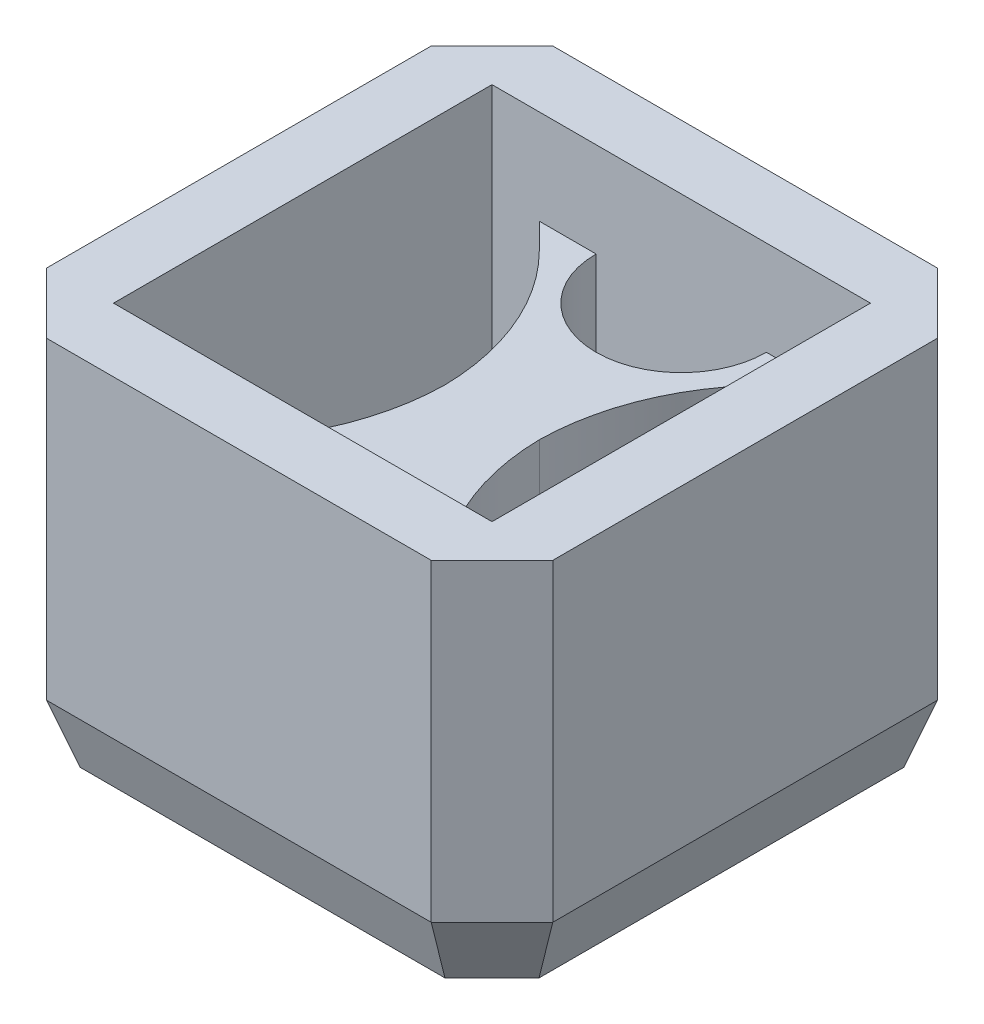
ISO-10303-21;
HEADER;
FILE_DESCRIPTION(('STEP AP214'),'2;1');
FILE_NAME('part.step','',(''),(''),'','','');
FILE_SCHEMA(('AUTOMOTIVE_DESIGN { 1 0 10303 214 1 1 1 1 }'));
ENDSEC;
DATA;
#1=APPLICATION_CONTEXT('core data for automotive mechanical design processes');
#2=APPLICATION_PROTOCOL_DEFINITION('international standard','automotive_design',2000,#1);
#3=PRODUCT_CONTEXT('',#1,'mechanical');
#4=PRODUCT('Part','Part','',(#3));
#5=PRODUCT_RELATED_PRODUCT_CATEGORY('part','',(#4));
#6=PRODUCT_DEFINITION_FORMATION('','',#4);
#7=PRODUCT_DEFINITION_CONTEXT('part definition',#1,'design');
#8=PRODUCT_DEFINITION('design','',#6,#7);
#9=PRODUCT_DEFINITION_SHAPE('','',#8);
#10=(LENGTH_UNIT() NAMED_UNIT(*) SI_UNIT(.MILLI.,.METRE.));
#11=(NAMED_UNIT(*) PLANE_ANGLE_UNIT() SI_UNIT($,.RADIAN.));
#12=(NAMED_UNIT(*) SI_UNIT($,.STERADIAN.) SOLID_ANGLE_UNIT());
#13=UNCERTAINTY_MEASURE_WITH_UNIT(LENGTH_MEASURE(1.E-05),#10,'distance_accuracy_value','');
#14=(GEOMETRIC_REPRESENTATION_CONTEXT(3) GLOBAL_UNCERTAINTY_ASSIGNED_CONTEXT((#13)) GLOBAL_UNIT_ASSIGNED_CONTEXT((#10,
#11,#12)) REPRESENTATION_CONTEXT('',''));
#15=CARTESIAN_POINT('',(0.,0.,0.));
#16=DIRECTION('',(0.,0.,1.));
#17=DIRECTION('',(1.,0.,0.));
#18=AXIS2_PLACEMENT_3D('',#15,#16,#17);
#19=CARTESIAN_POINT('',(4.,8.,4.));
#20=DIRECTION('',(0.,0.,-1.));
#21=DIRECTION('',(-1.,0.,0.));
#22=AXIS2_PLACEMENT_3D('',#19,#20,#21);
#23=PLANE('',#22);
#24=DIRECTION('',(-1.,0.,0.));
#25=VECTOR('',#24,1.);
#26=CARTESIAN_POINT('',(3.,6.,4.));
#27=LINE('',#26,#25);
#28=CARTESIAN_POINT('',(3.,6.,4.));
#29=VERTEX_POINT('',#28);
#30=CARTESIAN_POINT('',(1.8,6.,4.));
#31=VERTEX_POINT('',#30);
#32=EDGE_CURVE('E338',#29,#31,#27,.T.);
#33=ORIENTED_EDGE('',*,*,#32,.T.);
#34=DIRECTION('',(0.,-1.,0.));
#35=VECTOR('',#34,1.);
#36=CARTESIAN_POINT('',(1.8,18.,4.));
#37=LINE('',#36,#35);
#38=CARTESIAN_POINT('',(1.8,0.,4.));
#39=VERTEX_POINT('',#38);
#40=EDGE_CURVE('E337',#31,#39,#37,.T.);
#41=ORIENTED_EDGE('',*,*,#40,.T.);
#42=DIRECTION('',(1.,0.,0.));
#43=VECTOR('',#42,1.);
#44=CARTESIAN_POINT('',(4.,0.,4.));
#45=LINE('',#44,#43);
#46=CARTESIAN_POINT('',(-1.8,0.,4.));
#47=VERTEX_POINT('',#46);
#48=EDGE_CURVE('E363',#47,#39,#45,.T.);
#49=ORIENTED_EDGE('',*,*,#48,.F.);
#50=DIRECTION('',(0.,-1.,0.));
#51=VECTOR('',#50,1.);
#52=CARTESIAN_POINT('',(-1.8,18.,4.));
#53=LINE('',#52,#51);
#54=CARTESIAN_POINT('',(-1.8,6.,4.));
#55=VERTEX_POINT('',#54);
#56=EDGE_CURVE('E334',#55,#47,#53,.T.);
#57=ORIENTED_EDGE('',*,*,#56,.F.);
#58=DIRECTION('',(-1.,0.,0.));
#59=VECTOR('',#58,1.);
#60=CARTESIAN_POINT('',(-3.,6.,4.));
#61=LINE('',#60,#59);
#62=CARTESIAN_POINT('',(-3.,6.,4.));
#63=VERTEX_POINT('',#62);
#64=EDGE_CURVE('E332',#55,#63,#61,.T.);
#65=ORIENTED_EDGE('',*,*,#64,.T.);
#66=DIRECTION('',(0.,-1.,0.));
#67=VECTOR('',#66,1.);
#68=CARTESIAN_POINT('',(-3.,18.,4.));
#69=LINE('',#68,#67);
#70=CARTESIAN_POINT('',(-3.,0.,4.));
#71=VERTEX_POINT('',#70);
#72=EDGE_CURVE('E331',#63,#71,#69,.T.);
#73=ORIENTED_EDGE('',*,*,#72,.T.);
#74=CARTESIAN_POINT('',(-4.,0.,4.));
#75=VERTEX_POINT('',#74);
#76=EDGE_CURVE('E359',#75,#71,#45,.T.);
#77=ORIENTED_EDGE('',*,*,#76,.F.);
#78=DIRECTION('',(0.,-1.,0.));
#79=VECTOR('',#78,1.);
#80=CARTESIAN_POINT('',(-4.,8.,4.));
#81=LINE('',#80,#79);
#82=CARTESIAN_POINT('',(-4.,8.,4.));
#83=VERTEX_POINT('',#82);
#84=EDGE_CURVE('E376',#83,#75,#81,.T.);
#85=ORIENTED_EDGE('',*,*,#84,.F.);
#86=DIRECTION('',(1.,0.,0.));
#87=VECTOR('',#86,1.);
#88=CARTESIAN_POINT('',(4.,8.,4.));
#89=LINE('',#88,#87);
#90=CARTESIAN_POINT('',(4.,8.,4.));
#91=VERTEX_POINT('',#90);
#92=EDGE_CURVE('E349',#83,#91,#89,.T.);
#93=ORIENTED_EDGE('',*,*,#92,.T.);
#94=DIRECTION('',(0.,-1.,0.));
#95=VECTOR('',#94,1.);
#96=CARTESIAN_POINT('',(4.,8.,4.));
#97=LINE('',#96,#95);
#98=CARTESIAN_POINT('',(4.,0.,4.));
#99=VERTEX_POINT('',#98);
#100=EDGE_CURVE('E373',#91,#99,#97,.T.);
#101=ORIENTED_EDGE('',*,*,#100,.T.);
#102=CARTESIAN_POINT('',(3.,0.,4.));
#103=VERTEX_POINT('',#102);
#104=EDGE_CURVE('E358',#103,#99,#45,.T.);
#105=ORIENTED_EDGE('',*,*,#104,.F.);
#106=DIRECTION('',(0.,-1.,0.));
#107=VECTOR('',#106,1.);
#108=CARTESIAN_POINT('',(3.,18.,4.));
#109=LINE('',#108,#107);
#110=EDGE_CURVE('E326',#29,#103,#109,.T.);
#111=ORIENTED_EDGE('',*,*,#110,.F.);
#112=EDGE_LOOP('',(#33,#41,#49,#57,#65,#73,#77,#85,#93,#101,#105,#111));
#113=FACE_BOUND('',#112,.T.);
#114=ADVANCED_FACE('F37',(#113),#23,.T.);
#115=CARTESIAN_POINT('',(4.,8.,-4.));
#116=DIRECTION('',(0.,0.,1.));
#117=DIRECTION('',(1.,0.,0.));
#118=AXIS2_PLACEMENT_3D('',#115,#116,#117);
#119=PLANE('',#118);
#120=DIRECTION('',(-1.,0.,0.));
#121=VECTOR('',#120,1.);
#122=CARTESIAN_POINT('',(3.,6.,-4.));
#123=LINE('',#122,#121);
#124=CARTESIAN_POINT('',(3.,6.,-4.));
#125=VERTEX_POINT('',#124);
#126=CARTESIAN_POINT('',(1.8,6.,-4.));
#127=VERTEX_POINT('',#126);
#128=EDGE_CURVE('E249',#125,#127,#123,.T.);
#129=ORIENTED_EDGE('',*,*,#128,.F.);
#130=DIRECTION('',(0.,-1.,0.));
#131=VECTOR('',#130,1.);
#132=CARTESIAN_POINT('',(3.,18.,-4.));
#133=LINE('',#132,#131);
#134=CARTESIAN_POINT('',(3.,0.,-4.));
#135=VERTEX_POINT('',#134);
#136=EDGE_CURVE('E257',#125,#135,#133,.T.);
#137=ORIENTED_EDGE('',*,*,#136,.T.);
#138=DIRECTION('',(-1.,0.,0.));
#139=VECTOR('',#138,1.);
#140=CARTESIAN_POINT('',(4.,0.,-4.));
#141=LINE('',#140,#139);
#142=CARTESIAN_POINT('',(4.,0.,-4.));
#143=VERTEX_POINT('',#142);
#144=EDGE_CURVE('E350',#143,#135,#141,.T.);
#145=ORIENTED_EDGE('',*,*,#144,.F.);
#146=DIRECTION('',(0.,-1.,0.));
#147=VECTOR('',#146,1.);
#148=CARTESIAN_POINT('',(4.,8.,-4.));
#149=LINE('',#148,#147);
#150=CARTESIAN_POINT('',(4.,8.,-4.));
#151=VERTEX_POINT('',#150);
#152=EDGE_CURVE('E370',#151,#143,#149,.T.);
#153=ORIENTED_EDGE('',*,*,#152,.F.);
#154=DIRECTION('',(-1.,0.,0.));
#155=VECTOR('',#154,1.);
#156=CARTESIAN_POINT('',(4.,8.,-4.));
#157=LINE('',#156,#155);
#158=CARTESIAN_POINT('',(-4.,8.,-4.));
#159=VERTEX_POINT('',#158);
#160=EDGE_CURVE('E354',#151,#159,#157,.T.);
#161=ORIENTED_EDGE('',*,*,#160,.T.);
#162=DIRECTION('',(0.,-1.,0.));
#163=VECTOR('',#162,1.);
#164=CARTESIAN_POINT('',(-4.,8.,-4.));
#165=LINE('',#164,#163);
#166=CARTESIAN_POINT('',(-4.,0.,-4.));
#167=VERTEX_POINT('',#166);
#168=EDGE_CURVE('E356',#159,#167,#165,.T.);
#169=ORIENTED_EDGE('',*,*,#168,.T.);
#170=CARTESIAN_POINT('',(-3.,0.,-4.));
#171=VERTEX_POINT('',#170);
#172=EDGE_CURVE('E365',#171,#167,#141,.T.);
#173=ORIENTED_EDGE('',*,*,#172,.F.);
#174=DIRECTION('',(0.,-1.,0.));
#175=VECTOR('',#174,1.);
#176=CARTESIAN_POINT('',(-3.,18.,-4.));
#177=LINE('',#176,#175);
#178=CARTESIAN_POINT('',(-3.,6.,-4.));
#179=VERTEX_POINT('',#178);
#180=EDGE_CURVE('E278',#179,#171,#177,.T.);
#181=ORIENTED_EDGE('',*,*,#180,.F.);
#182=DIRECTION('',(-1.,0.,0.));
#183=VECTOR('',#182,1.);
#184=CARTESIAN_POINT('',(-3.,6.,-4.));
#185=LINE('',#184,#183);
#186=CARTESIAN_POINT('',(-1.8,6.,-4.));
#187=VERTEX_POINT('',#186);
#188=EDGE_CURVE('E265',#187,#179,#185,.T.);
#189=ORIENTED_EDGE('',*,*,#188,.F.);
#190=DIRECTION('',(0.,-1.,0.));
#191=VECTOR('',#190,1.);
#192=CARTESIAN_POINT('',(-1.8,18.,-4.));
#193=LINE('',#192,#191);
#194=CARTESIAN_POINT('',(-1.8,0.,-4.));
#195=VERTEX_POINT('',#194);
#196=EDGE_CURVE('E263',#187,#195,#193,.T.);
#197=ORIENTED_EDGE('',*,*,#196,.T.);
#198=CARTESIAN_POINT('',(1.8,0.,-4.));
#199=VERTEX_POINT('',#198);
#200=EDGE_CURVE('E252',#199,#195,#141,.T.);
#201=ORIENTED_EDGE('',*,*,#200,.F.);
#202=DIRECTION('',(0.,-1.,0.));
#203=VECTOR('',#202,1.);
#204=CARTESIAN_POINT('',(1.8,18.,-4.));
#205=LINE('',#204,#203);
#206=EDGE_CURVE('E244',#127,#199,#205,.T.);
#207=ORIENTED_EDGE('',*,*,#206,.F.);
#208=EDGE_LOOP('',(#129,#137,#145,#153,#161,#169,#173,#181,#189,#197,#201,#207));
#209=FACE_BOUND('',#208,.T.);
#210=ADVANCED_FACE('F246',(#209),#119,.T.);
#211=CARTESIAN_POINT('',(0.,18.,4.));
#212=DIRECTION('',(0.,-1.,0.));
#213=DIRECTION('',(0.,0.,-1.));
#214=AXIS2_PLACEMENT_3D('',#211,#212,#213);
#215=CYLINDRICAL_SURFACE('',#214,1.8);
#216=ORIENTED_EDGE('',*,*,#56,.T.);
#217=CARTESIAN_POINT('',(0.,0.,4.));
#218=DIRECTION('',(0.,1.,0.));
#219=DIRECTION('',(0.,0.,-1.));
#220=AXIS2_PLACEMENT_3D('',#217,#218,#219);
#221=CIRCLE('',#220,1.8);
#222=EDGE_CURVE('E322',#39,#47,#221,.T.);
#223=ORIENTED_EDGE('',*,*,#222,.F.);
#224=ORIENTED_EDGE('',*,*,#40,.F.);
#225=CARTESIAN_POINT('',(0.,6.,4.));
#226=DIRECTION('',(0.,1.,0.));
#227=DIRECTION('',(0.,0.,1.));
#228=AXIS2_PLACEMENT_3D('',#225,#226,#227);
#229=CIRCLE('',#228,1.8);
#230=EDGE_CURVE('E335',#31,#55,#229,.T.);
#231=ORIENTED_EDGE('',*,*,#230,.T.);
#232=EDGE_LOOP('',(#216,#223,#224,#231));
#233=FACE_BOUND('',#232,.T.);
#234=ADVANCED_FACE('F606',(#233),#215,.F.);
#235=CARTESIAN_POINT('',(4.,0.,0.));
#236=DIRECTION('',(0.,0.,1.));
#237=DIRECTION('',(1.,0.,0.));
#238=AXIS2_PLACEMENT_3D('',#235,#236,#237);
#239=PLANE('',#238);
#240=DIRECTION('',(0.,-1.,0.));
#241=VECTOR('',#240,1.);
#242=CARTESIAN_POINT('',(1.,0.,0.));
#243=LINE('',#242,#241);
#244=CARTESIAN_POINT('',(1.,6.,0.));
#245=VERTEX_POINT('',#244);
#246=CARTESIAN_POINT('',(1.,0.,0.));
#247=VERTEX_POINT('',#246);
#248=EDGE_CURVE('E475',#245,#247,#243,.T.);
#249=ORIENTED_EDGE('',*,*,#248,.F.);
#250=DIRECTION('',(1.,0.,0.));
#251=VECTOR('',#250,1.);
#252=CARTESIAN_POINT('',(0.,6.,0.));
#253=LINE('',#252,#251);
#254=CARTESIAN_POINT('',(1.00050508889981,6.,0.));
#255=VERTEX_POINT('',#254);
#256=EDGE_CURVE('E284',#245,#255,#253,.T.);
#257=ORIENTED_EDGE('',*,*,#256,.T.);
#258=DIRECTION('',(0.,1.,0.));
#259=VECTOR('',#258,1.);
#260=CARTESIAN_POINT('',(1.00050508889981,18.,0.));
#261=LINE('',#260,#259);
#262=CARTESIAN_POINT('',(1.00050508889981,0.,0.));
#263=VERTEX_POINT('',#262);
#264=EDGE_CURVE('E469',#263,#255,#261,.T.);
#265=ORIENTED_EDGE('',*,*,#264,.F.);
#266=DIRECTION('',(1.,0.,0.));
#267=VECTOR('',#266,1.);
#268=CARTESIAN_POINT('',(4.,0.,0.));
#269=LINE('',#268,#267);
#270=EDGE_CURVE('E285',#247,#263,#269,.T.);
#271=ORIENTED_EDGE('',*,*,#270,.F.);
#272=EDGE_LOOP('',(#249,#257,#265,#271));
#273=FACE_BOUND('',#272,.T.);
#274=ADVANCED_FACE('F492',(#273),#239,.F.);
#275=DIRECTION('',(0.,1.,0.));
#276=VECTOR('',#275,1.);
#277=CARTESIAN_POINT('',(-1.,0.,0.));
#278=LINE('',#277,#276);
#279=CARTESIAN_POINT('',(-0.999999999999999,0.,0.));
#280=VERTEX_POINT('',#279);
#281=CARTESIAN_POINT('',(-0.999999999999999,6.,0.));
#282=VERTEX_POINT('',#281);
#283=EDGE_CURVE('E472',#280,#282,#278,.T.);
#284=ORIENTED_EDGE('',*,*,#283,.F.);
#285=CARTESIAN_POINT('',(-1.00050508889981,0.,0.));
#286=VERTEX_POINT('',#285);
#287=EDGE_CURVE('E281',#286,#280,#269,.T.);
#288=ORIENTED_EDGE('',*,*,#287,.F.);
#289=DIRECTION('',(0.,1.,0.));
#290=VECTOR('',#289,1.);
#291=CARTESIAN_POINT('',(-1.00050508889981,18.,0.));
#292=LINE('',#291,#290);
#293=CARTESIAN_POINT('',(-1.00050508889981,6.,0.));
#294=VERTEX_POINT('',#293);
#295=EDGE_CURVE('E289',#294,#286,#292,.F.);
#296=ORIENTED_EDGE('',*,*,#295,.F.);
#297=EDGE_CURVE('E286',#294,#282,#253,.T.);
#298=ORIENTED_EDGE('',*,*,#297,.T.);
#299=EDGE_LOOP('',(#284,#288,#296,#298));
#300=FACE_BOUND('',#299,.T.);
#301=ADVANCED_FACE('F532',(#300),#239,.F.);
#302=CARTESIAN_POINT('',(0.,8.,0.));
#303=DIRECTION('',(0.,1.,0.));
#304=DIRECTION('',(0.,0.,1.));
#305=AXIS2_PLACEMENT_3D('',#302,#303,#304);
#306=PLANE('',#305);
#307=ORIENTED_EDGE('',*,*,#92,.F.);
#308=DIRECTION('',(0.,0.,1.));
#309=VECTOR('',#308,1.);
#310=CARTESIAN_POINT('',(-4.,8.,4.));
#311=LINE('',#310,#309);
#312=EDGE_CURVE('E347',#159,#83,#311,.T.);
#313=ORIENTED_EDGE('',*,*,#312,.F.);
#314=ORIENTED_EDGE('',*,*,#160,.F.);
#315=DIRECTION('',(0.,0.,-1.));
#316=VECTOR('',#315,1.);
#317=CARTESIAN_POINT('',(4.,8.,4.));
#318=LINE('',#317,#316);
#319=EDGE_CURVE('E352',#91,#151,#318,.T.);
#320=ORIENTED_EDGE('',*,*,#319,.F.);
#321=EDGE_LOOP('',(#307,#313,#314,#320));
#322=FACE_BOUND('',#321,.T.);
#323=DIRECTION('',(0.707106781186547,0.,-0.707106781186548));
#324=VECTOR('',#323,1.);
#325=CARTESIAN_POINT('',(2.75735931288071,8.,6.65685424949238));
#326=LINE('',#325,#324);
#327=CARTESIAN_POINT('',(4.06421356237309,8.,5.35));
#328=VERTEX_POINT('',#327);
#329=CARTESIAN_POINT('',(5.35,8.,4.06421356237309));
#330=VERTEX_POINT('',#329);
#331=EDGE_CURVE('E379',#328,#330,#326,.T.);
#332=ORIENTED_EDGE('',*,*,#331,.T.);
#333=DIRECTION('',(0.,0.,-1.));
#334=VECTOR('',#333,1.);
#335=CARTESIAN_POINT('',(5.35,8.,5.35));
#336=LINE('',#335,#334);
#337=CARTESIAN_POINT('',(5.35,8.,-4.0642135623731));
#338=VERTEX_POINT('',#337);
#339=EDGE_CURVE('E293',#330,#338,#336,.T.);
#340=ORIENTED_EDGE('',*,*,#339,.T.);
#341=DIRECTION('',(-0.707106781186548,0.,-0.707106781186547));
#342=VECTOR('',#341,1.);
#343=CARTESIAN_POINT('',(6.65685424949238,8.,-2.75735931288072));
#344=LINE('',#343,#342);
#345=CARTESIAN_POINT('',(4.06421356237309,8.,-5.35));
#346=VERTEX_POINT('',#345);
#347=EDGE_CURVE('E382',#338,#346,#344,.T.);
#348=ORIENTED_EDGE('',*,*,#347,.T.);
#349=DIRECTION('',(-1.,0.,0.));
#350=VECTOR('',#349,1.);
#351=CARTESIAN_POINT('',(-5.35,8.,-5.35));
#352=LINE('',#351,#350);
#353=CARTESIAN_POINT('',(-4.0642135623731,8.,-5.35));
#354=VERTEX_POINT('',#353);
#355=EDGE_CURVE('E296',#346,#354,#352,.T.);
#356=ORIENTED_EDGE('',*,*,#355,.T.);
#357=DIRECTION('',(-0.707106781186547,0.,0.707106781186548));
#358=VECTOR('',#357,1.);
#359=CARTESIAN_POINT('',(-2.75735931288072,8.,-6.65685424949238));
#360=LINE('',#359,#358);
#361=CARTESIAN_POINT('',(-5.35,8.,-4.06421356237309));
#362=VERTEX_POINT('',#361);
#363=EDGE_CURVE('E385',#354,#362,#360,.T.);
#364=ORIENTED_EDGE('',*,*,#363,.T.);
#365=DIRECTION('',(0.,0.,1.));
#366=VECTOR('',#365,1.);
#367=CARTESIAN_POINT('',(-5.35,8.,5.35));
#368=LINE('',#367,#366);
#369=CARTESIAN_POINT('',(-5.35,8.,4.0642135623731));
#370=VERTEX_POINT('',#369);
#371=EDGE_CURVE('E300',#362,#370,#368,.T.);
#372=ORIENTED_EDGE('',*,*,#371,.T.);
#373=DIRECTION('',(0.707106781186548,0.,0.707106781186547));
#374=VECTOR('',#373,1.);
#375=CARTESIAN_POINT('',(-6.65685424949238,8.,2.75735931288072));
#376=LINE('',#375,#374);
#377=CARTESIAN_POINT('',(-4.0642135623731,8.,5.35));
#378=VERTEX_POINT('',#377);
#379=EDGE_CURVE('E388',#370,#378,#376,.T.);
#380=ORIENTED_EDGE('',*,*,#379,.T.);
#381=DIRECTION('',(1.,0.,0.));
#382=VECTOR('',#381,1.);
#383=CARTESIAN_POINT('',(-5.35,8.,5.35));
#384=LINE('',#383,#382);
#385=EDGE_CURVE('E303',#378,#328,#384,.T.);
#386=ORIENTED_EDGE('',*,*,#385,.T.);
#387=EDGE_LOOP('',(#332,#340,#348,#356,#364,#372,#380,#386));
#388=FACE_BOUND('',#387,.T.);
#389=ADVANCED_FACE('F510',(#322,#388),#306,.T.);
#390=CARTESIAN_POINT('',(0.,0.,0.));
#391=DIRECTION('',(0.,1.,0.));
#392=DIRECTION('',(0.,0.,1.));
#393=AXIS2_PLACEMENT_3D('',#390,#391,#392);
#394=PLANE('',#393);
#395=ORIENTED_EDGE('',*,*,#287,.T.);
#396=CARTESIAN_POINT('',(-5.99948760108723,0.,0.0715802107782442));
#397=DIRECTION('',(0.,1.,0.));
#398=DIRECTION('',(0.,0.,1.));
#399=AXIS2_PLACEMENT_3D('',#396,#397,#398);
#400=CIRCLE('',#399,5.);
#401=CARTESIAN_POINT('',(-2.46395369515449,0.,-3.46395369515449));
#402=VERTEX_POINT('',#401);
#403=EDGE_CURVE('E481',#280,#402,#400,.T.);
#404=ORIENTED_EDGE('',*,*,#403,.T.);
#405=DIRECTION('',(0.707106781186548,0.,0.707106781186547));
#406=VECTOR('',#405,1.);
#407=CARTESIAN_POINT('',(-1.,0.,-2.));
#408=LINE('',#407,#406);
#409=EDGE_CURVE('E271',#171,#402,#408,.T.);
#410=ORIENTED_EDGE('',*,*,#409,.F.);
#411=ORIENTED_EDGE('',*,*,#172,.T.);
#412=DIRECTION('',(0.,0.,1.));
#413=VECTOR('',#412,1.);
#414=CARTESIAN_POINT('',(-4.,0.,4.));
#415=LINE('',#414,#413);
#416=EDGE_CURVE('E330',#167,#75,#415,.T.);
#417=ORIENTED_EDGE('',*,*,#416,.T.);
#418=ORIENTED_EDGE('',*,*,#76,.T.);
#419=DIRECTION('',(0.707106781186548,0.,-0.707106781186548));
#420=VECTOR('',#419,1.);
#421=CARTESIAN_POINT('',(-1.,0.,2.));
#422=LINE('',#421,#420);
#423=CARTESIAN_POINT('',(-2.46446609406726,0.,3.46446609406726));
#424=VERTEX_POINT('',#423);
#425=EDGE_CURVE('E318',#71,#424,#422,.T.);
#426=ORIENTED_EDGE('',*,*,#425,.T.);
#427=CARTESIAN_POINT('',(-6.,0.,-0.0710678118654754));
#428=DIRECTION('',(0.,1.,0.));
#429=DIRECTION('',(0.,0.,1.));
#430=AXIS2_PLACEMENT_3D('',#427,#428,#429);
#431=CIRCLE('',#430,5.);
#432=EDGE_CURVE('E459',#424,#286,#431,.T.);
#433=ORIENTED_EDGE('',*,*,#432,.T.);
#434=EDGE_LOOP('',(#395,#404,#410,#411,#417,#418,#426,#433));
#435=FACE_BOUND('',#434,.T.);
#436=DIRECTION('',(0.707106781186547,0.,-0.707106781186548));
#437=VECTOR('',#436,1.);
#438=CARTESIAN_POINT('',(0.999999999999999,0.,-2.));
#439=LINE('',#438,#437);
#440=CARTESIAN_POINT('',(2.46395369515449,0.,-3.46395369515449));
#441=VERTEX_POINT('',#440);
#442=EDGE_CURVE('E275',#441,#135,#439,.T.);
#443=ORIENTED_EDGE('',*,*,#442,.F.);
#444=CARTESIAN_POINT('',(5.99948760108723,0.,0.0715802107782442));
#445=DIRECTION('',(0.,1.,0.));
#446=DIRECTION('',(0.,0.,1.));
#447=AXIS2_PLACEMENT_3D('',#444,#445,#446);
#448=CIRCLE('',#447,5.);
#449=EDGE_CURVE('E45',#441,#247,#448,.T.);
#450=ORIENTED_EDGE('',*,*,#449,.T.);
#451=ORIENTED_EDGE('',*,*,#270,.T.);
#452=CARTESIAN_POINT('',(6.,0.,-0.0710678118654739));
#453=DIRECTION('',(0.,1.,0.));
#454=DIRECTION('',(0.,0.,1.));
#455=AXIS2_PLACEMENT_3D('',#452,#453,#454);
#456=CIRCLE('',#455,5.);
#457=CARTESIAN_POINT('',(2.46446609406726,0.,3.46446609406726));
#458=VERTEX_POINT('',#457);
#459=EDGE_CURVE('E464',#263,#458,#456,.T.);
#460=ORIENTED_EDGE('',*,*,#459,.T.);
#461=DIRECTION('',(0.707106781186547,0.,0.707106781186548));
#462=VECTOR('',#461,1.);
#463=CARTESIAN_POINT('',(1.,0.,2.));
#464=LINE('',#463,#462);
#465=EDGE_CURVE('E317',#458,#103,#464,.T.);
#466=ORIENTED_EDGE('',*,*,#465,.T.);
#467=ORIENTED_EDGE('',*,*,#104,.T.);
#468=DIRECTION('',(0.,0.,-1.));
#469=VECTOR('',#468,1.);
#470=CARTESIAN_POINT('',(4.,0.,4.));
#471=LINE('',#470,#469);
#472=EDGE_CURVE('E362',#99,#143,#471,.T.);
#473=ORIENTED_EDGE('',*,*,#472,.T.);
#474=ORIENTED_EDGE('',*,*,#144,.T.);
#475=EDGE_LOOP('',(#443,#450,#451,#460,#466,#467,#473,#474));
#476=FACE_BOUND('',#475,.T.);
#477=ORIENTED_EDGE('',*,*,#222,.T.);
#478=ORIENTED_EDGE('',*,*,#48,.T.);
#479=EDGE_LOOP('',(#477,#478));
#480=FACE_BOUND('',#479,.T.);
#481=ORIENTED_EDGE('',*,*,#200,.T.);
#482=CARTESIAN_POINT('',(0.,0.,-4.));
#483=DIRECTION('',(0.,-1.,0.));
#484=DIRECTION('',(0.,0.,1.));
#485=AXIS2_PLACEMENT_3D('',#482,#483,#484);
#486=CIRCLE('',#485,1.8);
#487=EDGE_CURVE('E256',#199,#195,#486,.T.);
#488=ORIENTED_EDGE('',*,*,#487,.F.);
#489=EDGE_LOOP('',(#481,#488));
#490=FACE_BOUND('',#489,.T.);
#491=DIRECTION('',(1.,0.,0.));
#492=VECTOR('',#491,1.);
#493=CARTESIAN_POINT('',(4.06421356237309,0.,-4.85));
#494=LINE('',#493,#492);
#495=CARTESIAN_POINT('',(-3.85710678118655,0.,-4.85));
#496=VERTEX_POINT('',#495);
#497=CARTESIAN_POINT('',(3.85710678118655,0.,-4.85));
#498=VERTEX_POINT('',#497);
#499=EDGE_CURVE('E415',#496,#498,#494,.T.);
#500=ORIENTED_EDGE('',*,*,#499,.T.);
#501=DIRECTION('',(0.707106781186548,0.,0.707106781186547));
#502=VECTOR('',#501,1.);
#503=CARTESIAN_POINT('',(4.35355339059327,0.,-4.35355339059327));
#504=LINE('',#503,#502);
#505=CARTESIAN_POINT('',(4.85,0.,-3.85710678118655));
#506=VERTEX_POINT('',#505);
#507=EDGE_CURVE('E417',#498,#506,#504,.T.);
#508=ORIENTED_EDGE('',*,*,#507,.T.);
#509=DIRECTION('',(0.,0.,1.));
#510=VECTOR('',#509,1.);
#511=CARTESIAN_POINT('',(4.85,0.,4.06421356237309));
#512=LINE('',#511,#510);
#513=CARTESIAN_POINT('',(4.85,0.,3.85710678118655));
#514=VERTEX_POINT('',#513);
#515=EDGE_CURVE('E403',#506,#514,#512,.T.);
#516=ORIENTED_EDGE('',*,*,#515,.T.);
#517=DIRECTION('',(-0.707106781186547,0.,0.707106781186548));
#518=VECTOR('',#517,1.);
#519=CARTESIAN_POINT('',(4.35355339059327,0.,4.35355339059327));
#520=LINE('',#519,#518);
#521=CARTESIAN_POINT('',(3.85710678118655,0.,4.85));
#522=VERTEX_POINT('',#521);
#523=EDGE_CURVE('E405',#514,#522,#520,.T.);
#524=ORIENTED_EDGE('',*,*,#523,.T.);
#525=DIRECTION('',(-1.,0.,0.));
#526=VECTOR('',#525,1.);
#527=CARTESIAN_POINT('',(-4.0642135623731,0.,4.85));
#528=LINE('',#527,#526);
#529=CARTESIAN_POINT('',(-3.85710678118655,0.,4.85));
#530=VERTEX_POINT('',#529);
#531=EDGE_CURVE('E407',#522,#530,#528,.T.);
#532=ORIENTED_EDGE('',*,*,#531,.T.);
#533=DIRECTION('',(-0.707106781186548,0.,-0.707106781186547));
#534=VECTOR('',#533,1.);
#535=CARTESIAN_POINT('',(-4.35355339059327,0.,4.35355339059328));
#536=LINE('',#535,#534);
#537=CARTESIAN_POINT('',(-4.85,0.,3.85710678118655));
#538=VERTEX_POINT('',#537);
#539=EDGE_CURVE('E409',#530,#538,#536,.T.);
#540=ORIENTED_EDGE('',*,*,#539,.T.);
#541=DIRECTION('',(0.,0.,-1.));
#542=VECTOR('',#541,1.);
#543=CARTESIAN_POINT('',(-4.85,0.,-4.06421356237309));
#544=LINE('',#543,#542);
#545=CARTESIAN_POINT('',(-4.85,0.,-3.85710678118655));
#546=VERTEX_POINT('',#545);
#547=EDGE_CURVE('E411',#538,#546,#544,.T.);
#548=ORIENTED_EDGE('',*,*,#547,.T.);
#549=DIRECTION('',(0.707106781186547,0.,-0.707106781186548));
#550=VECTOR('',#549,1.);
#551=CARTESIAN_POINT('',(-4.35355339059327,0.,-4.35355339059327));
#552=LINE('',#551,#550);
#553=EDGE_CURVE('E413',#546,#496,#552,.T.);
#554=ORIENTED_EDGE('',*,*,#553,.T.);
#555=EDGE_LOOP('',(#500,#508,#516,#524,#532,#540,#548,#554));
#556=FACE_BOUND('',#555,.T.);
#557=ADVANCED_FACE('F487',(#435,#476,#480,#490,#556),#394,.F.);
#558=CARTESIAN_POINT('',(2.75735931288071,8.,6.65685424949238));
#559=DIRECTION('',(-0.707106781186548,0.,-0.707106781186547));
#560=DIRECTION('',(-0.707106781186547,0.,0.707106781186548));
#561=AXIS2_PLACEMENT_3D('',#558,#559,#560);
#562=PLANE('',#561);
#563=DIRECTION('',(0.,1.,0.));
#564=VECTOR('',#563,1.);
#565=CARTESIAN_POINT('',(4.06421356237309,8.,5.35));
#566=LINE('',#565,#564);
#567=CARTESIAN_POINT('',(4.06421356237309,1.37373870972731,5.35));
#568=VERTEX_POINT('',#567);
#569=EDGE_CURVE('E309',#568,#328,#566,.T.);
#570=ORIENTED_EDGE('',*,*,#569,.F.);
#571=DIRECTION('',(0.707106781186547,0.,-0.707106781186548));
#572=VECTOR('',#571,1.);
#573=CARTESIAN_POINT('',(2.75735931288071,1.37373870972731,6.65685424949238));
#574=LINE('',#573,#572);
#575=CARTESIAN_POINT('',(5.35,1.37373870972731,4.06421356237309));
#576=VERTEX_POINT('',#575);
#577=EDGE_CURVE('E430',#568,#576,#574,.T.);
#578=ORIENTED_EDGE('',*,*,#577,.T.);
#579=DIRECTION('',(0.,-1.,0.));
#580=VECTOR('',#579,1.);
#581=CARTESIAN_POINT('',(5.35,8.,4.06421356237309));
#582=LINE('',#581,#580);
#583=EDGE_CURVE('E314',#330,#576,#582,.T.);
#584=ORIENTED_EDGE('',*,*,#583,.F.);
#585=ORIENTED_EDGE('',*,*,#331,.F.);
#586=EDGE_LOOP('',(#570,#578,#584,#585));
#587=FACE_BOUND('',#586,.T.);
#588=ADVANCED_FACE('F549',(#587),#562,.F.);
#589=CARTESIAN_POINT('',(6.65685424949238,8.,-2.75735931288072));
#590=DIRECTION('',(-0.707106781186547,0.,0.707106781186548));
#591=DIRECTION('',(0.707106781186548,0.,0.707106781186547));
#592=AXIS2_PLACEMENT_3D('',#589,#590,#591);
#593=PLANE('',#592);
#594=DIRECTION('',(0.,1.,0.));
#595=VECTOR('',#594,1.);
#596=CARTESIAN_POINT('',(5.35,8.,-4.0642135623731));
#597=LINE('',#596,#595);
#598=CARTESIAN_POINT('',(5.35,1.37373870972731,-4.0642135623731));
#599=VERTEX_POINT('',#598);
#600=EDGE_CURVE('E398',#599,#338,#597,.T.);
#601=ORIENTED_EDGE('',*,*,#600,.F.);
#602=DIRECTION('',(-0.707106781186548,0.,-0.707106781186547));
#603=VECTOR('',#602,1.);
#604=CARTESIAN_POINT('',(6.65685424949238,1.37373870972731,-2.75735931288072));
#605=LINE('',#604,#603);
#606=CARTESIAN_POINT('',(4.06421356237309,1.37373870972731,-5.35));
#607=VERTEX_POINT('',#606);
#608=EDGE_CURVE('E400',#599,#607,#605,.T.);
#609=ORIENTED_EDGE('',*,*,#608,.T.);
#610=DIRECTION('',(0.,-1.,0.));
#611=VECTOR('',#610,1.);
#612=CARTESIAN_POINT('',(4.06421356237309,8.,-5.35));
#613=LINE('',#612,#611);
#614=EDGE_CURVE('E311',#346,#607,#613,.T.);
#615=ORIENTED_EDGE('',*,*,#614,.F.);
#616=ORIENTED_EDGE('',*,*,#347,.F.);
#617=EDGE_LOOP('',(#601,#609,#615,#616));
#618=FACE_BOUND('',#617,.T.);
#619=ADVANCED_FACE('F569',(#618),#593,.F.);
#620=CARTESIAN_POINT('',(-2.75735931288072,8.,-6.65685424949238));
#621=DIRECTION('',(0.707106781186548,0.,0.707106781186547));
#622=DIRECTION('',(0.707106781186547,0.,-0.707106781186548));
#623=AXIS2_PLACEMENT_3D('',#620,#621,#622);
#624=PLANE('',#623);
#625=DIRECTION('',(0.,1.,0.));
#626=VECTOR('',#625,1.);
#627=CARTESIAN_POINT('',(-4.0642135623731,8.,-5.35));
#628=LINE('',#627,#626);
#629=CARTESIAN_POINT('',(-4.0642135623731,1.37373870972731,-5.35));
#630=VERTEX_POINT('',#629);
#631=EDGE_CURVE('E396',#630,#354,#628,.T.);
#632=ORIENTED_EDGE('',*,*,#631,.F.);
#633=DIRECTION('',(-0.707106781186547,0.,0.707106781186548));
#634=VECTOR('',#633,1.);
#635=CARTESIAN_POINT('',(-2.75735931288072,1.37373870972731,-6.65685424949238));
#636=LINE('',#635,#634);
#637=CARTESIAN_POINT('',(-5.35,1.37373870972731,-4.06421356237309));
#638=VERTEX_POINT('',#637);
#639=EDGE_CURVE('E422',#630,#638,#636,.T.);
#640=ORIENTED_EDGE('',*,*,#639,.T.);
#641=DIRECTION('',(0.,-1.,0.));
#642=VECTOR('',#641,1.);
#643=CARTESIAN_POINT('',(-5.35,8.,-4.06421356237309));
#644=LINE('',#643,#642);
#645=EDGE_CURVE('E306',#362,#638,#644,.T.);
#646=ORIENTED_EDGE('',*,*,#645,.F.);
#647=ORIENTED_EDGE('',*,*,#363,.F.);
#648=EDGE_LOOP('',(#632,#640,#646,#647));
#649=FACE_BOUND('',#648,.T.);
#650=ADVANCED_FACE('F575',(#649),#624,.F.);
#651=CARTESIAN_POINT('',(-6.65685424949238,8.,2.75735931288072));
#652=DIRECTION('',(0.707106781186547,0.,-0.707106781186548));
#653=DIRECTION('',(-0.707106781186548,0.,-0.707106781186547));
#654=AXIS2_PLACEMENT_3D('',#651,#652,#653);
#655=PLANE('',#654);
#656=DIRECTION('',(0.,1.,0.));
#657=VECTOR('',#656,1.);
#658=CARTESIAN_POINT('',(-5.35,8.,4.0642135623731));
#659=LINE('',#658,#657);
#660=CARTESIAN_POINT('',(-5.35,1.37373870972731,4.0642135623731));
#661=VERTEX_POINT('',#660);
#662=EDGE_CURVE('E391',#661,#370,#659,.T.);
#663=ORIENTED_EDGE('',*,*,#662,.F.);
#664=DIRECTION('',(0.707106781186548,0.,0.707106781186547));
#665=VECTOR('',#664,1.);
#666=CARTESIAN_POINT('',(-6.65685424949238,1.37373870972731,2.75735931288072));
#667=LINE('',#666,#665);
#668=CARTESIAN_POINT('',(-4.0642135623731,1.37373870972731,5.35));
#669=VERTEX_POINT('',#668);
#670=EDGE_CURVE('E426',#661,#669,#667,.T.);
#671=ORIENTED_EDGE('',*,*,#670,.T.);
#672=DIRECTION('',(0.,-1.,0.));
#673=VECTOR('',#672,1.);
#674=CARTESIAN_POINT('',(-4.0642135623731,8.,5.35));
#675=LINE('',#674,#673);
#676=EDGE_CURVE('E393',#378,#669,#675,.T.);
#677=ORIENTED_EDGE('',*,*,#676,.F.);
#678=ORIENTED_EDGE('',*,*,#379,.F.);
#679=EDGE_LOOP('',(#663,#671,#677,#678));
#680=FACE_BOUND('',#679,.T.);
#681=ADVANCED_FACE('F612',(#680),#655,.F.);
#682=CARTESIAN_POINT('',(-4.,8.,4.));
#683=DIRECTION('',(1.,0.,0.));
#684=DIRECTION('',(0.,0.,-1.));
#685=AXIS2_PLACEMENT_3D('',#682,#683,#684);
#686=PLANE('',#685);
#687=ORIENTED_EDGE('',*,*,#84,.T.);
#688=ORIENTED_EDGE('',*,*,#416,.F.);
#689=ORIENTED_EDGE('',*,*,#168,.F.);
#690=ORIENTED_EDGE('',*,*,#312,.T.);
#691=EDGE_LOOP('',(#687,#688,#689,#690));
#692=FACE_BOUND('',#691,.T.);
#693=ADVANCED_FACE('F514',(#692),#686,.T.);
#694=CARTESIAN_POINT('',(4.,8.,4.));
#695=DIRECTION('',(-1.,0.,0.));
#696=DIRECTION('',(0.,0.,1.));
#697=AXIS2_PLACEMENT_3D('',#694,#695,#696);
#698=PLANE('',#697);
#699=ORIENTED_EDGE('',*,*,#319,.T.);
#700=ORIENTED_EDGE('',*,*,#152,.T.);
#701=ORIENTED_EDGE('',*,*,#472,.F.);
#702=ORIENTED_EDGE('',*,*,#100,.F.);
#703=EDGE_LOOP('',(#699,#700,#701,#702));
#704=FACE_BOUND('',#703,.T.);
#705=ADVANCED_FACE('F503',(#704),#698,.T.);
#706=CARTESIAN_POINT('',(0.,6.,0.));
#707=DIRECTION('',(0.,1.,0.));
#708=DIRECTION('',(0.,0.,1.));
#709=AXIS2_PLACEMENT_3D('',#706,#707,#708);
#710=PLANE('',#709);
#711=ORIENTED_EDGE('',*,*,#64,.F.);
#712=ORIENTED_EDGE('',*,*,#230,.F.);
#713=ORIENTED_EDGE('',*,*,#32,.F.);
#714=DIRECTION('',(0.707106781186547,0.,0.707106781186548));
#715=VECTOR('',#714,1.);
#716=CARTESIAN_POINT('',(1.,6.,2.));
#717=LINE('',#716,#715);
#718=CARTESIAN_POINT('',(2.46446609406726,6.,3.46446609406726));
#719=VERTEX_POINT('',#718);
#720=EDGE_CURVE('E321',#719,#29,#717,.T.);
#721=ORIENTED_EDGE('',*,*,#720,.F.);
#722=CARTESIAN_POINT('',(6.,6.,-0.0710678118654739));
#723=DIRECTION('',(0.,1.,0.));
#724=DIRECTION('',(0.,0.,1.));
#725=AXIS2_PLACEMENT_3D('',#722,#723,#724);
#726=CIRCLE('',#725,5.);
#727=EDGE_CURVE('E466',#719,#255,#726,.F.);
#728=ORIENTED_EDGE('',*,*,#727,.T.);
#729=ORIENTED_EDGE('',*,*,#256,.F.);
#730=CARTESIAN_POINT('',(5.99948760108723,6.,0.0715802107782442));
#731=DIRECTION('',(0.,1.,0.));
#732=DIRECTION('',(0.,0.,1.));
#733=AXIS2_PLACEMENT_3D('',#730,#731,#732);
#734=CIRCLE('',#733,5.);
#735=CARTESIAN_POINT('',(2.46395369515449,6.,-3.46395369515449));
#736=VERTEX_POINT('',#735);
#737=EDGE_CURVE('E13',#245,#736,#734,.F.);
#738=ORIENTED_EDGE('',*,*,#737,.T.);
#739=DIRECTION('',(0.707106781186547,0.,-0.707106781186548));
#740=VECTOR('',#739,1.);
#741=CARTESIAN_POINT('',(0.999999999999999,6.,-2.));
#742=LINE('',#741,#740);
#743=EDGE_CURVE('E269',#736,#125,#742,.T.);
#744=ORIENTED_EDGE('',*,*,#743,.T.);
#745=ORIENTED_EDGE('',*,*,#128,.T.);
#746=CARTESIAN_POINT('',(0.,6.,-4.));
#747=DIRECTION('',(0.,1.,0.));
#748=DIRECTION('',(0.,0.,1.));
#749=AXIS2_PLACEMENT_3D('',#746,#747,#748);
#750=CIRCLE('',#749,1.8);
#751=EDGE_CURVE('E261',#127,#187,#750,.F.);
#752=ORIENTED_EDGE('',*,*,#751,.T.);
#753=ORIENTED_EDGE('',*,*,#188,.T.);
#754=DIRECTION('',(0.707106781186548,0.,0.707106781186547));
#755=VECTOR('',#754,1.);
#756=CARTESIAN_POINT('',(-1.,6.,-2.));
#757=LINE('',#756,#755);
#758=CARTESIAN_POINT('',(-2.46395369515449,6.,-3.46395369515449));
#759=VERTEX_POINT('',#758);
#760=EDGE_CURVE('E494',#179,#759,#757,.T.);
#761=ORIENTED_EDGE('',*,*,#760,.T.);
#762=CARTESIAN_POINT('',(-5.99948760108723,6.,0.0715802107782442));
#763=DIRECTION('',(0.,1.,0.));
#764=DIRECTION('',(0.,0.,1.));
#765=AXIS2_PLACEMENT_3D('',#762,#763,#764);
#766=CIRCLE('',#765,5.);
#767=EDGE_CURVE('E483',#759,#282,#766,.F.);
#768=ORIENTED_EDGE('',*,*,#767,.T.);
#769=ORIENTED_EDGE('',*,*,#297,.F.);
#770=CARTESIAN_POINT('',(-6.,6.,-0.0710678118654754));
#771=DIRECTION('',(0.,1.,0.));
#772=DIRECTION('',(0.,0.,1.));
#773=AXIS2_PLACEMENT_3D('',#770,#771,#772);
#774=CIRCLE('',#773,5.);
#775=CARTESIAN_POINT('',(-2.46446609406726,6.,3.46446609406726));
#776=VERTEX_POINT('',#775);
#777=EDGE_CURVE('E462',#294,#776,#774,.F.);
#778=ORIENTED_EDGE('',*,*,#777,.T.);
#779=DIRECTION('',(0.707106781186548,0.,-0.707106781186548));
#780=VECTOR('',#779,1.);
#781=CARTESIAN_POINT('',(-1.,6.,2.));
#782=LINE('',#781,#780);
#783=EDGE_CURVE('E327',#63,#776,#782,.T.);
#784=ORIENTED_EDGE('',*,*,#783,.F.);
#785=EDGE_LOOP('',(#711,#712,#713,#721,#728,#729,#738,#744,#745,#752,#753,#761,#768,#769,#778,#784));
#786=FACE_BOUND('',#785,.T.);
#787=ADVANCED_FACE('F268',(#786),#710,.T.);
#788=CARTESIAN_POINT('',(1.,18.,2.));
#789=DIRECTION('',(0.707106781186548,0.,-0.707106781186547));
#790=DIRECTION('',(-0.707106781186547,0.,-0.707106781186548));
#791=AXIS2_PLACEMENT_3D('',#788,#789,#790);
#792=PLANE('',#791);
#793=ORIENTED_EDGE('',*,*,#465,.F.);
#794=DIRECTION('',(0.,-1.,0.));
#795=VECTOR('',#794,1.);
#796=CARTESIAN_POINT('',(2.46446609406726,6.,3.46446609406726));
#797=LINE('',#796,#795);
#798=EDGE_CURVE('E457',#458,#719,#797,.F.);
#799=ORIENTED_EDGE('',*,*,#798,.T.);
#800=ORIENTED_EDGE('',*,*,#720,.T.);
#801=ORIENTED_EDGE('',*,*,#110,.T.);
#802=EDGE_LOOP('',(#793,#799,#800,#801));
#803=FACE_BOUND('',#802,.T.);
#804=ADVANCED_FACE('F743',(#803),#792,.T.);
#805=CARTESIAN_POINT('',(-1.,18.,2.));
#806=DIRECTION('',(-0.707106781186548,0.,-0.707106781186548));
#807=DIRECTION('',(-0.707106781186548,0.,0.707106781186548));
#808=AXIS2_PLACEMENT_3D('',#805,#806,#807);
#809=PLANE('',#808);
#810=ORIENTED_EDGE('',*,*,#783,.T.);
#811=DIRECTION('',(0.,-1.,0.));
#812=VECTOR('',#811,1.);
#813=CARTESIAN_POINT('',(-2.46446609406726,0.,3.46446609406726));
#814=LINE('',#813,#812);
#815=EDGE_CURVE('E434',#776,#424,#814,.T.);
#816=ORIENTED_EDGE('',*,*,#815,.T.);
#817=ORIENTED_EDGE('',*,*,#425,.F.);
#818=ORIENTED_EDGE('',*,*,#72,.F.);
#819=EDGE_LOOP('',(#810,#816,#817,#818));
#820=FACE_BOUND('',#819,.T.);
#821=ADVANCED_FACE('F522',(#820),#809,.T.);
#822=CARTESIAN_POINT('',(-5.35,0.,5.35));
#823=DIRECTION('',(-1.,0.,0.));
#824=DIRECTION('',(0.,0.,1.));
#825=AXIS2_PLACEMENT_3D('',#822,#823,#824);
#826=PLANE('',#825);
#827=ORIENTED_EDGE('',*,*,#645,.T.);
#828=DIRECTION('',(0.,0.,1.));
#829=VECTOR('',#828,1.);
#830=CARTESIAN_POINT('',(-5.35,1.37373870972731,4.0642135623731));
#831=LINE('',#830,#829);
#832=EDGE_CURVE('E424',#638,#661,#831,.T.);
#833=ORIENTED_EDGE('',*,*,#832,.T.);
#834=ORIENTED_EDGE('',*,*,#662,.T.);
#835=ORIENTED_EDGE('',*,*,#371,.F.);
#836=EDGE_LOOP('',(#827,#833,#834,#835));
#837=FACE_BOUND('',#836,.T.);
#838=ADVANCED_FACE('F579',(#837),#826,.T.);
#839=CARTESIAN_POINT('',(-5.35,0.,5.35));
#840=DIRECTION('',(0.,0.,1.));
#841=DIRECTION('',(1.,0.,0.));
#842=AXIS2_PLACEMENT_3D('',#839,#840,#841);
#843=PLANE('',#842);
#844=ORIENTED_EDGE('',*,*,#676,.T.);
#845=DIRECTION('',(1.,0.,0.));
#846=VECTOR('',#845,1.);
#847=CARTESIAN_POINT('',(4.06421356237309,1.37373870972731,5.35));
#848=LINE('',#847,#846);
#849=EDGE_CURVE('E428',#669,#568,#848,.T.);
#850=ORIENTED_EDGE('',*,*,#849,.T.);
#851=ORIENTED_EDGE('',*,*,#569,.T.);
#852=ORIENTED_EDGE('',*,*,#385,.F.);
#853=EDGE_LOOP('',(#844,#850,#851,#852));
#854=FACE_BOUND('',#853,.T.);
#855=ADVANCED_FACE('F806',(#854),#843,.T.);
#856=CARTESIAN_POINT('',(-5.35,0.,-5.35));
#857=DIRECTION('',(0.,0.,-1.));
#858=DIRECTION('',(-1.,0.,0.));
#859=AXIS2_PLACEMENT_3D('',#856,#857,#858);
#860=PLANE('',#859);
#861=ORIENTED_EDGE('',*,*,#614,.T.);
#862=DIRECTION('',(-1.,0.,0.));
#863=VECTOR('',#862,1.);
#864=CARTESIAN_POINT('',(-4.0642135623731,1.37373870972731,-5.35));
#865=LINE('',#864,#863);
#866=EDGE_CURVE('E420',#607,#630,#865,.T.);
#867=ORIENTED_EDGE('',*,*,#866,.T.);
#868=ORIENTED_EDGE('',*,*,#631,.T.);
#869=ORIENTED_EDGE('',*,*,#355,.F.);
#870=EDGE_LOOP('',(#861,#867,#868,#869));
#871=FACE_BOUND('',#870,.T.);
#872=ADVANCED_FACE('F571',(#871),#860,.T.);
#873=CARTESIAN_POINT('',(5.35,0.,5.35));
#874=DIRECTION('',(1.,0.,0.));
#875=DIRECTION('',(0.,0.,-1.));
#876=AXIS2_PLACEMENT_3D('',#873,#874,#875);
#877=PLANE('',#876);
#878=ORIENTED_EDGE('',*,*,#583,.T.);
#879=DIRECTION('',(0.,0.,-1.));
#880=VECTOR('',#879,1.);
#881=CARTESIAN_POINT('',(5.35,1.37373870972731,-4.0642135623731));
#882=LINE('',#881,#880);
#883=EDGE_CURVE('E432',#576,#599,#882,.T.);
#884=ORIENTED_EDGE('',*,*,#883,.T.);
#885=ORIENTED_EDGE('',*,*,#600,.T.);
#886=ORIENTED_EDGE('',*,*,#339,.F.);
#887=EDGE_LOOP('',(#878,#884,#885,#886));
#888=FACE_BOUND('',#887,.T.);
#889=ADVANCED_FACE('F822',(#888),#877,.T.);
#890=CARTESIAN_POINT('',(-6.65685424949238,1.37373870972731,2.75735931288072));
#891=DIRECTION('',(0.664463024388675,0.342020143325669,-0.664463024388675));
#892=DIRECTION('',(0.707106781186548,0.,0.707106781186547));
#893=AXIS2_PLACEMENT_3D('',#890,#891,#892);
#894=PLANE('',#893);
#895=DIRECTION('',(-0.338638749317281,0.930402317101582,0.14026876271228));
#896=VECTOR('',#895,1.);
#897=CARTESIAN_POINT('',(-5.43778893286324,1.61493682044708,4.10057692899131));
#898=LINE('',#897,#896);
#899=EDGE_CURVE('E450',#538,#661,#898,.T.);
#900=ORIENTED_EDGE('',*,*,#899,.F.);
#901=ORIENTED_EDGE('',*,*,#539,.F.);
#902=DIRECTION('',(-0.140268762712279,0.930402317101583,0.338638749317281));
#903=VECTOR('',#902,1.);
#904=CARTESIAN_POINT('',(-4.08951182943341,1.5415420455267,5.41107541944155));
#905=LINE('',#904,#903);
#906=EDGE_CURVE('E297',#669,#530,#905,.F.);
#907=ORIENTED_EDGE('',*,*,#906,.F.);
#908=ORIENTED_EDGE('',*,*,#670,.F.);
#909=EDGE_LOOP('',(#900,#901,#907,#908));
#910=FACE_BOUND('',#909,.T.);
#911=ADVANCED_FACE('F830',(#910),#894,.F.);
#912=CARTESIAN_POINT('',(-5.35,1.37373870972731,5.35));
#913=DIRECTION('',(0.,-0.342020143325669,0.939692620785908));
#914=DIRECTION('',(-1.,0.,0.));
#915=AXIS2_PLACEMENT_3D('',#912,#913,#914);
#916=PLANE('',#915);
#917=ORIENTED_EDGE('',*,*,#906,.T.);
#918=ORIENTED_EDGE('',*,*,#531,.F.);
#919=DIRECTION('',(0.14026876271228,0.930402317101582,0.338638749317281));
#920=VECTOR('',#919,1.);
#921=CARTESIAN_POINT('',(4.10057692899131,1.61493682044708,5.43778893286324));
#922=LINE('',#921,#920);
#923=EDGE_CURVE('E447',#568,#522,#922,.F.);
#924=ORIENTED_EDGE('',*,*,#923,.F.);
#925=ORIENTED_EDGE('',*,*,#849,.F.);
#926=EDGE_LOOP('',(#917,#918,#924,#925));
#927=FACE_BOUND('',#926,.T.);
#928=ADVANCED_FACE('F839',(#927),#916,.T.);
#929=CARTESIAN_POINT('',(-5.35,1.37373870972731,5.35));
#930=DIRECTION('',(-0.939692620785908,-0.342020143325669,0.));
#931=DIRECTION('',(0.,0.,-1.));
#932=AXIS2_PLACEMENT_3D('',#929,#930,#931);
#933=PLANE('',#932);
#934=ORIENTED_EDGE('',*,*,#899,.T.);
#935=ORIENTED_EDGE('',*,*,#832,.F.);
#936=DIRECTION('',(-0.338638749317281,0.930402317101582,-0.140268762712281));
#937=VECTOR('',#936,1.);
#938=CARTESIAN_POINT('',(-4.90282072884864,0.145123759790785,-3.87898584345008));
#939=LINE('',#938,#937);
#940=EDGE_CURVE('E444',#546,#638,#939,.T.);
#941=ORIENTED_EDGE('',*,*,#940,.F.);
#942=ORIENTED_EDGE('',*,*,#547,.F.);
#943=EDGE_LOOP('',(#934,#935,#941,#942));
#944=FACE_BOUND('',#943,.T.);
#945=ADVANCED_FACE('F583',(#944),#933,.T.);
#946=CARTESIAN_POINT('',(2.75735931288071,1.37373870972731,6.65685424949238));
#947=DIRECTION('',(-0.664463024388675,0.342020143325669,-0.664463024388674));
#948=DIRECTION('',(0.707106781186547,0.,-0.707106781186548));
#949=AXIS2_PLACEMENT_3D('',#946,#947,#948);
#950=PLANE('',#949);
#951=ORIENTED_EDGE('',*,*,#923,.T.);
#952=ORIENTED_EDGE('',*,*,#523,.F.);
#953=DIRECTION('',(0.338638749317281,0.930402317101583,0.14026876271228));
#954=VECTOR('',#953,1.);
#955=CARTESIAN_POINT('',(5.41107541944155,1.5415420455267,4.08951182943341));
#956=LINE('',#955,#954);
#957=EDGE_CURVE('E441',#576,#514,#956,.F.);
#958=ORIENTED_EDGE('',*,*,#957,.F.);
#959=ORIENTED_EDGE('',*,*,#577,.F.);
#960=EDGE_LOOP('',(#951,#952,#958,#959));
#961=FACE_BOUND('',#960,.T.);
#962=ADVANCED_FACE('F590',(#961),#950,.F.);
#963=CARTESIAN_POINT('',(-2.75735931288072,1.37373870972731,-6.65685424949238));
#964=DIRECTION('',(0.664463024388675,0.34202014332567,0.664463024388674));
#965=DIRECTION('',(-0.707106781186547,0.,0.707106781186548));
#966=AXIS2_PLACEMENT_3D('',#963,#964,#965);
#967=PLANE('',#966);
#968=ORIENTED_EDGE('',*,*,#940,.T.);
#969=ORIENTED_EDGE('',*,*,#639,.F.);
#970=DIRECTION('',(-0.140268762712281,0.930402317101582,-0.338638749317281));
#971=VECTOR('',#970,1.);
#972=CARTESIAN_POINT('',(-4.10057692899131,1.61493682044708,-5.43778893286324));
#973=LINE('',#972,#971);
#974=EDGE_CURVE('E438',#496,#630,#973,.T.);
#975=ORIENTED_EDGE('',*,*,#974,.F.);
#976=ORIENTED_EDGE('',*,*,#553,.F.);
#977=EDGE_LOOP('',(#968,#969,#975,#976));
#978=FACE_BOUND('',#977,.T.);
#979=ADVANCED_FACE('F587',(#978),#967,.F.);
#980=CARTESIAN_POINT('',(5.35,1.37373870972731,5.35));
#981=DIRECTION('',(0.939692620785908,-0.342020143325669,0.));
#982=DIRECTION('',(0.,0.,1.));
#983=AXIS2_PLACEMENT_3D('',#980,#981,#982);
#984=PLANE('',#983);
#985=ORIENTED_EDGE('',*,*,#957,.T.);
#986=ORIENTED_EDGE('',*,*,#515,.F.);
#987=DIRECTION('',(-0.338638749317281,-0.930402317101582,0.14026876271228));
#988=VECTOR('',#987,1.);
#989=CARTESIAN_POINT('',(4.90282072884864,0.14512375979079,-3.87898584345009));
#990=LINE('',#989,#988);
#991=EDGE_CURVE('E436',#599,#506,#990,.T.);
#992=ORIENTED_EDGE('',*,*,#991,.F.);
#993=ORIENTED_EDGE('',*,*,#883,.F.);
#994=EDGE_LOOP('',(#985,#986,#992,#993));
#995=FACE_BOUND('',#994,.T.);
#996=ADVANCED_FACE('F589',(#995),#984,.T.);
#997=CARTESIAN_POINT('',(-5.35,1.37373870972731,-5.35));
#998=DIRECTION('',(0.,-0.342020143325669,-0.939692620785908));
#999=DIRECTION('',(1.,0.,0.));
#1000=AXIS2_PLACEMENT_3D('',#997,#998,#999);
#1001=PLANE('',#1000);
#1002=ORIENTED_EDGE('',*,*,#974,.T.);
#1003=ORIENTED_EDGE('',*,*,#866,.F.);
#1004=DIRECTION('',(0.14026876271228,0.930402317101582,-0.338638749317281));
#1005=VECTOR('',#1004,1.);
#1006=CARTESIAN_POINT('',(3.87898584345009,0.145123759790791,-4.90282072884864));
#1007=LINE('',#1006,#1005);
#1008=EDGE_CURVE('E292',#498,#607,#1007,.T.);
#1009=ORIENTED_EDGE('',*,*,#1008,.F.);
#1010=ORIENTED_EDGE('',*,*,#499,.F.);
#1011=EDGE_LOOP('',(#1002,#1003,#1009,#1010));
#1012=FACE_BOUND('',#1011,.T.);
#1013=ADVANCED_FACE('F563',(#1012),#1001,.T.);
#1014=CARTESIAN_POINT('',(6.65685424949238,1.37373870972731,-2.75735931288072));
#1015=DIRECTION('',(-0.664463024388674,0.342020143325669,0.664463024388675));
#1016=DIRECTION('',(-0.707106781186548,0.,-0.707106781186547));
#1017=AXIS2_PLACEMENT_3D('',#1014,#1015,#1016);
#1018=PLANE('',#1017);
#1019=ORIENTED_EDGE('',*,*,#991,.T.);
#1020=ORIENTED_EDGE('',*,*,#507,.F.);
#1021=ORIENTED_EDGE('',*,*,#1008,.T.);
#1022=ORIENTED_EDGE('',*,*,#608,.F.);
#1023=EDGE_LOOP('',(#1019,#1020,#1021,#1022));
#1024=FACE_BOUND('',#1023,.T.);
#1025=ADVANCED_FACE('F558',(#1024),#1018,.F.);
#1026=CARTESIAN_POINT('',(-6.,18.,-0.0710678118654754));
#1027=DIRECTION('',(0.,1.,0.));
#1028=DIRECTION('',(0.,0.,1.));
#1029=AXIS2_PLACEMENT_3D('',#1026,#1027,#1028);
#1030=CYLINDRICAL_SURFACE('',#1029,5.);
#1031=ORIENTED_EDGE('',*,*,#777,.F.);
#1032=ORIENTED_EDGE('',*,*,#295,.T.);
#1033=ORIENTED_EDGE('',*,*,#432,.F.);
#1034=ORIENTED_EDGE('',*,*,#815,.F.);
#1035=EDGE_LOOP('',(#1031,#1032,#1033,#1034));
#1036=FACE_BOUND('',#1035,.T.);
#1037=ADVANCED_FACE('F527',(#1036),#1030,.F.);
#1038=CARTESIAN_POINT('',(6.,18.,-0.0710678118654739));
#1039=DIRECTION('',(0.,1.,0.));
#1040=DIRECTION('',(0.,0.,1.));
#1041=AXIS2_PLACEMENT_3D('',#1038,#1039,#1040);
#1042=CYLINDRICAL_SURFACE('',#1041,5.);
#1043=ORIENTED_EDGE('',*,*,#459,.F.);
#1044=ORIENTED_EDGE('',*,*,#264,.T.);
#1045=ORIENTED_EDGE('',*,*,#727,.F.);
#1046=ORIENTED_EDGE('',*,*,#798,.F.);
#1047=EDGE_LOOP('',(#1043,#1044,#1045,#1046));
#1048=FACE_BOUND('',#1047,.T.);
#1049=ADVANCED_FACE('F643',(#1048),#1042,.F.);
#1050=CARTESIAN_POINT('',(-1.,18.,-2.));
#1051=DIRECTION('',(0.707106781186547,0.,-0.707106781186548));
#1052=DIRECTION('',(-0.707106781186548,0.,-0.707106781186547));
#1053=AXIS2_PLACEMENT_3D('',#1050,#1051,#1052);
#1054=PLANE('',#1053);
#1055=ORIENTED_EDGE('',*,*,#409,.T.);
#1056=DIRECTION('',(0.,-1.,0.));
#1057=VECTOR('',#1056,1.);
#1058=CARTESIAN_POINT('',(-2.46395369515449,18.,-3.46395369515449));
#1059=LINE('',#1058,#1057);
#1060=EDGE_CURVE('E477',#402,#759,#1059,.F.);
#1061=ORIENTED_EDGE('',*,*,#1060,.T.);
#1062=ORIENTED_EDGE('',*,*,#760,.F.);
#1063=ORIENTED_EDGE('',*,*,#180,.T.);
#1064=EDGE_LOOP('',(#1055,#1061,#1062,#1063));
#1065=FACE_BOUND('',#1064,.T.);
#1066=ADVANCED_FACE('F541',(#1065),#1054,.F.);
#1067=CARTESIAN_POINT('',(0.,18.,-4.));
#1068=DIRECTION('',(0.,-1.,0.));
#1069=DIRECTION('',(0.,0.,-1.));
#1070=AXIS2_PLACEMENT_3D('',#1067,#1068,#1069);
#1071=CYLINDRICAL_SURFACE('',#1070,1.8);
#1072=ORIENTED_EDGE('',*,*,#751,.F.);
#1073=ORIENTED_EDGE('',*,*,#206,.T.);
#1074=ORIENTED_EDGE('',*,*,#487,.T.);
#1075=ORIENTED_EDGE('',*,*,#196,.F.);
#1076=EDGE_LOOP('',(#1072,#1073,#1074,#1075));
#1077=FACE_BOUND('',#1076,.T.);
#1078=ADVANCED_FACE('F262',(#1077),#1071,.F.);
#1079=CARTESIAN_POINT('',(0.999999999999999,18.,-2.));
#1080=DIRECTION('',(-0.707106781186548,0.,-0.707106781186547));
#1081=DIRECTION('',(-0.707106781186547,0.,0.707106781186548));
#1082=AXIS2_PLACEMENT_3D('',#1079,#1080,#1081);
#1083=PLANE('',#1082);
#1084=ORIENTED_EDGE('',*,*,#743,.F.);
#1085=DIRECTION('',(0.,1.,0.));
#1086=VECTOR('',#1085,1.);
#1087=CARTESIAN_POINT('',(2.46395369515449,18.,-3.46395369515449));
#1088=LINE('',#1087,#1086);
#1089=EDGE_CURVE('E479',#736,#441,#1088,.F.);
#1090=ORIENTED_EDGE('',*,*,#1089,.T.);
#1091=ORIENTED_EDGE('',*,*,#442,.T.);
#1092=ORIENTED_EDGE('',*,*,#136,.F.);
#1093=EDGE_LOOP('',(#1084,#1090,#1091,#1092));
#1094=FACE_BOUND('',#1093,.T.);
#1095=ADVANCED_FACE('F496',(#1094),#1083,.F.);
#1096=CARTESIAN_POINT('',(-5.99948760108723,18.,0.0715802107782442));
#1097=DIRECTION('',(0.,-1.,0.));
#1098=DIRECTION('',(0.,0.,-1.));
#1099=AXIS2_PLACEMENT_3D('',#1096,#1097,#1098);
#1100=CYLINDRICAL_SURFACE('',#1099,5.);
#1101=ORIENTED_EDGE('',*,*,#767,.F.);
#1102=ORIENTED_EDGE('',*,*,#1060,.F.);
#1103=ORIENTED_EDGE('',*,*,#403,.F.);
#1104=ORIENTED_EDGE('',*,*,#283,.T.);
#1105=EDGE_LOOP('',(#1101,#1102,#1103,#1104));
#1106=FACE_BOUND('',#1105,.T.);
#1107=ADVANCED_FACE('F536',(#1106),#1100,.F.);
#1108=CARTESIAN_POINT('',(5.99948760108723,18.,0.0715802107782442));
#1109=DIRECTION('',(0.,1.,0.));
#1110=DIRECTION('',(0.,0.,1.));
#1111=AXIS2_PLACEMENT_3D('',#1108,#1109,#1110);
#1112=CYLINDRICAL_SURFACE('',#1111,5.);
#1113=ORIENTED_EDGE('',*,*,#737,.F.);
#1114=ORIENTED_EDGE('',*,*,#248,.T.);
#1115=ORIENTED_EDGE('',*,*,#449,.F.);
#1116=ORIENTED_EDGE('',*,*,#1089,.F.);
#1117=EDGE_LOOP('',(#1113,#1114,#1115,#1116));
#1118=FACE_BOUND('',#1117,.T.);
#1119=ADVANCED_FACE('F39',(#1118),#1112,.F.);
#1120=CLOSED_SHELL('',(#114,#210,#234,#274,#301,#389,#557,#588,#619,#650,#681,#693,#705,#787,
#804,#821,#838,#855,#872,#889,#911,#928,#945,#962,#979,#996,#1013,#1025,#1037,#1049,#1066,#1078,
#1095,#1107,#1119));
#1121=MANIFOLD_SOLID_BREP('B2',#1120);
#1122=ADVANCED_BREP_SHAPE_REPRESENTATION('',(#18,#1121),#14);
#1123=SHAPE_DEFINITION_REPRESENTATION(#9,#1122);
ENDSEC;
END-ISO-10303-21;
